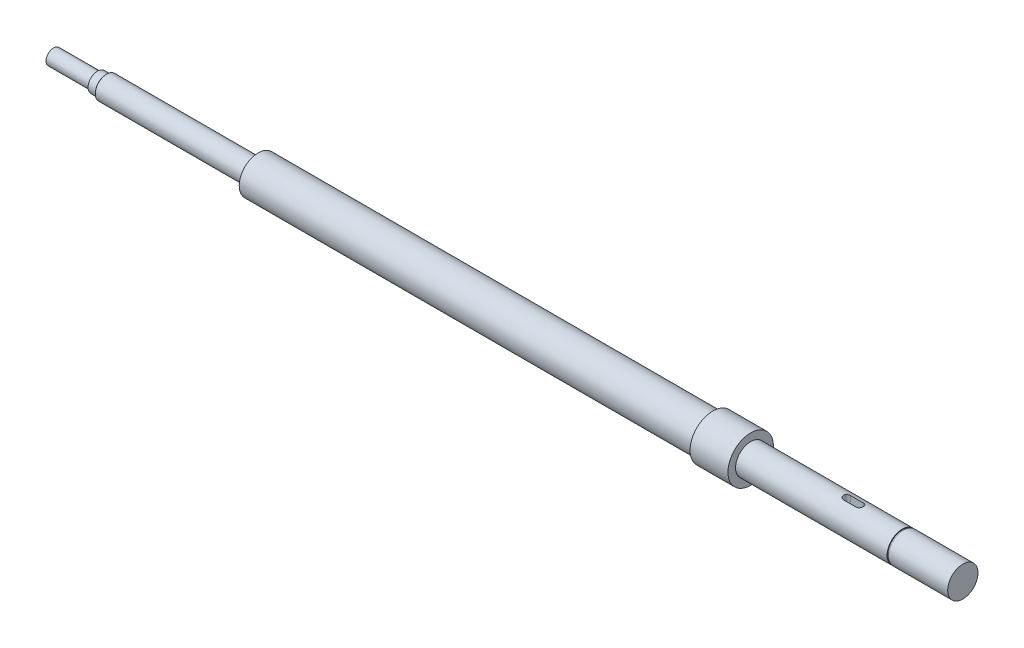
ISO-10303-21;
HEADER;
FILE_DESCRIPTION(('STEP AP214'),'2;1');
FILE_NAME('part.step','',(''),(''),'','','');
FILE_SCHEMA(('AUTOMOTIVE_DESIGN { 1 0 10303 214 1 1 1 1 }'));
ENDSEC;
DATA;
#1=APPLICATION_CONTEXT('core data for automotive mechanical design processes');
#2=APPLICATION_PROTOCOL_DEFINITION('international standard','automotive_design',2000,#1);
#3=PRODUCT_CONTEXT('',#1,'mechanical');
#4=PRODUCT('Part','Part','',(#3));
#5=PRODUCT_RELATED_PRODUCT_CATEGORY('part','',(#4));
#6=PRODUCT_DEFINITION_FORMATION('','',#4);
#7=PRODUCT_DEFINITION_CONTEXT('part definition',#1,'design');
#8=PRODUCT_DEFINITION('design','',#6,#7);
#9=PRODUCT_DEFINITION_SHAPE('','',#8);
#10=(LENGTH_UNIT() NAMED_UNIT(*) SI_UNIT(.MILLI.,.METRE.));
#11=(NAMED_UNIT(*) PLANE_ANGLE_UNIT() SI_UNIT($,.RADIAN.));
#12=(NAMED_UNIT(*) SI_UNIT($,.STERADIAN.) SOLID_ANGLE_UNIT());
#13=UNCERTAINTY_MEASURE_WITH_UNIT(LENGTH_MEASURE(1.E-05),#10,'distance_accuracy_value','');
#14=(GEOMETRIC_REPRESENTATION_CONTEXT(3) GLOBAL_UNCERTAINTY_ASSIGNED_CONTEXT((#13)) GLOBAL_UNIT_ASSIGNED_CONTEXT((#10,
#11,#12)) REPRESENTATION_CONTEXT('',''));
#15=CARTESIAN_POINT('',(0.,0.,0.));
#16=DIRECTION('',(0.,0.,1.));
#17=DIRECTION('',(1.,0.,0.));
#18=AXIS2_PLACEMENT_3D('',#15,#16,#17);
#19=CARTESIAN_POINT('',(560.,0.,0.));
#20=DIRECTION('',(-1.,0.,0.));
#21=DIRECTION('',(0.,0.,1.));
#22=AXIS2_PLACEMENT_3D('',#19,#20,#21);
#23=CYLINDRICAL_SURFACE('',#22,10.);
#24=CARTESIAN_POINT('',(560.,0.,0.));
#25=DIRECTION('',(-1.,0.,0.));
#26=DIRECTION('',(0.,0.,1.));
#27=AXIS2_PLACEMENT_3D('',#24,#25,#26);
#28=CIRCLE('',#27,10.);
#29=CARTESIAN_POINT('',(560.,0.,10.));
#30=VERTEX_POINT('',#29);
#31=EDGE_CURVE('E414',#30,#30,#28,.F.);
#32=ORIENTED_EDGE('',*,*,#31,.F.);
#33=EDGE_LOOP('',(#32));
#34=FACE_BOUND('',#33,.T.);
#35=CARTESIAN_POINT('',(460.,0.,0.));
#36=DIRECTION('',(-1.,0.,0.));
#37=DIRECTION('',(0.,0.,1.));
#38=AXIS2_PLACEMENT_3D('',#35,#36,#37);
#39=CIRCLE('',#38,10.);
#40=CARTESIAN_POINT('',(460.,0.,10.));
#41=VERTEX_POINT('',#40);
#42=EDGE_CURVE('E419',#41,#41,#39,.T.);
#43=ORIENTED_EDGE('',*,*,#42,.F.);
#44=EDGE_LOOP('',(#43));
#45=FACE_BOUND('',#44,.T.);
#46=DIRECTION('',(-1.,0.,0.));
#47=VECTOR('',#46,1.);
#48=CARTESIAN_POINT('',(560.,-9.716185001749,-2.36553355752731));
#49=LINE('',#48,#47);
#50=CARTESIAN_POINT('',(532.010381059042,-9.716185001749,-2.36553355752731));
#51=VERTEX_POINT('',#50);
#52=CARTESIAN_POINT('',(523.620270870022,-9.716185001749,-2.36553355752731));
#53=VERTEX_POINT('',#52);
#54=EDGE_CURVE('E456',#51,#53,#49,.T.);
#55=ORIENTED_EDGE('',*,*,#54,.T.);
#56=CARTESIAN_POINT('',(523.620270870022,-9.716185001749,-2.36553355752731));
#57=CARTESIAN_POINT('',(523.554734219503,-9.71617813615582,-2.36554101061923));
#58=CARTESIAN_POINT('',(523.489201902924,-9.71684792605506,-2.36281014204706));
#59=CARTESIAN_POINT('',(523.35862497444,-9.71948992140805,-2.35192962666516));
#60=CARTESIAN_POINT('',(523.293580288446,-9.72146192477843,-2.34378082063412));
#61=CARTESIAN_POINT('',(523.16455605733,-9.72665269246422,-2.32214222404428));
#62=CARTESIAN_POINT('',(523.100574769825,-9.72986915190057,-2.30866230631367));
#63=CARTESIAN_POINT('',(522.974025136161,-9.73744767182783,-2.27648498541819));
#64=CARTESIAN_POINT('',(522.911456805409,-9.74180974480331,-2.25778752539391));
#65=CARTESIAN_POINT('',(522.726529861349,-9.75643328055067,-2.19406830206997));
#66=CARTESIAN_POINT('',(522.60682772248,-9.76823730970764,-2.14139912730308));
#67=CARTESIAN_POINT('',(522.377991044977,-9.79461754473958,-2.01729176434513));
#68=CARTESIAN_POINT('',(522.268858845049,-9.80919436201676,-1.94584943532952));
#69=CARTESIAN_POINT('',(522.062063166862,-9.83979766287969,-1.78471538783754));
#70=CARTESIAN_POINT('',(521.964635549542,-9.85584515791481,-1.69472439774039));
#71=CARTESIAN_POINT('',(521.786104744101,-9.88739971424029,-1.49968977610094));
#72=CARTESIAN_POINT('',(521.70500413809,-9.90290668972761,-1.39464376810435));
#73=CARTESIAN_POINT('',(521.560473201778,-9.93186429008413,-1.17087013949126));
#74=CARTESIAN_POINT('',(521.49727436327,-9.94528704297193,-1.05198906921125));
#75=CARTESIAN_POINT('',(521.391847429846,-9.96832286380811,-0.80492786347149));
#76=CARTESIAN_POINT('',(521.349615508137,-9.97793662689216,-0.67674942982469));
#77=CARTESIAN_POINT('',(521.288071771701,-9.99212278814533,-0.417203439663509));
#78=CARTESIAN_POINT('',(521.268356614351,-9.996783795409,-0.285936451191038));
#79=CARTESIAN_POINT('',(521.251142201607,-10.0008473204292,-0.0218780336812813));
#80=CARTESIAN_POINT('',(521.253640491668,-10.0002504191748,0.110913225307553));
#81=CARTESIAN_POINT('',(521.280488178315,-9.99393192326267,0.371454673270837));
#82=CARTESIAN_POINT('',(521.304401979146,-9.98831249229277,0.499252595421149));
#83=CARTESIAN_POINT('',(521.372704167039,-9.9726982129403,0.748966787582892));
#84=CARTESIAN_POINT('',(521.417093401907,-9.96270318338231,0.870882813817257));
#85=CARTESIAN_POINT('',(521.525453939881,-9.93930073089943,1.10655021769589));
#86=CARTESIAN_POINT('',(521.589585001563,-9.92586562450444,1.22022527563861));
#87=CARTESIAN_POINT('',(521.735487132521,-9.89704804120039,1.43535259240749));
#88=CARTESIAN_POINT('',(521.817260522926,-9.88166530816026,1.53680324017866));
#89=CARTESIAN_POINT('',(521.99846615468,-9.85019619513032,1.72718935199965));
#90=CARTESIAN_POINT('',(522.098277501328,-9.83410179459663,1.81576297894188));
#91=CARTESIAN_POINT('',(522.311535414834,-9.8033631548963,1.97501139727239));
#92=CARTESIAN_POINT('',(522.424985692825,-9.78871931241045,2.04568130075511));
#93=CARTESIAN_POINT('',(522.662972769855,-9.76251130099033,2.16732020882583));
#94=CARTESIAN_POINT('',(522.787557058201,-9.75096125437306,2.2181993357095));
#95=CARTESIAN_POINT('',(523.043772276872,-9.7324389446703,2.2981173708448));
#96=CARTESIAN_POINT('',(523.175392382633,-9.72545985664113,2.3271888497891));
#97=CARTESIAN_POINT('',(523.360151755326,-9.7195271780491,2.35177034119793));
#98=CARTESIAN_POINT('',(523.412077472829,-9.7182756252396,2.35693272635749));
#99=CARTESIAN_POINT('',(523.516084310452,-9.71660500821227,2.3638103125256));
#100=CARTESIAN_POINT('',(523.568165034806,-9.71618457891591,2.36553116613077));
#101=CARTESIAN_POINT('',(523.620270870022,-9.716185001749,2.36553355752731));
#102=B_SPLINE_CURVE_WITH_KNOTS('',3,(#56,#57,#58,#59,#60,#61,#62,#63,#64,#65,#66,#67,#68,#69,
#70,#71,#72,#73,#74,#75,#76,#77,#78,#79,#80,#81,#82,#83,#84,#85,#86,#87,#88,#89,#90,#91,#92,#93,
#94,#95,#96,#97,#98,#99,#100,#101),.UNSPECIFIED.,.F.,.F.,(4,2,2,2,2,2,2,2,2,2,2,2,2,2,2,2,2,2,2,
2,2,2,4),(0.,0.1965421552874,0.393053817439709,0.589203245848046,0.785354811924298,
1.17729236123002,1.56931643349763,1.96824542021148,2.36723744788776,2.77117515918009,
3.17503911837194,3.57154924838462,3.96801556531298,4.35659636782447,4.74519326138159,
5.13702139411566,5.52890110953009,5.9302543298031,6.33171700594944,6.73498216967495,
7.13764383313922,7.29413852940338,7.45037597674334),.UNSPECIFIED.);
#103=CARTESIAN_POINT('',(523.620270870022,-9.716185001749,2.36553355752731));
#104=VERTEX_POINT('',#103);
#105=EDGE_CURVE('E345',#53,#104,#102,.T.);
#106=ORIENTED_EDGE('',*,*,#105,.T.);
#107=DIRECTION('',(-1.,0.,0.));
#108=VECTOR('',#107,1.);
#109=CARTESIAN_POINT('',(560.,-9.716185001749,2.36553355752731));
#110=LINE('',#109,#108);
#111=CARTESIAN_POINT('',(532.010381059042,-9.716185001749,2.36553355752731));
#112=VERTEX_POINT('',#111);
#113=EDGE_CURVE('E467',#104,#112,#110,.F.);
#114=ORIENTED_EDGE('',*,*,#113,.T.);
#115=CARTESIAN_POINT('',(532.010381059042,-9.716185001749,2.36553355752731));
#116=CARTESIAN_POINT('',(532.075917709561,-9.71617813615582,2.36554101061923));
#117=CARTESIAN_POINT('',(532.141450026139,-9.71684792605506,2.36281014204706));
#118=CARTESIAN_POINT('',(532.272026954624,-9.71948992140805,2.35192962666516));
#119=CARTESIAN_POINT('',(532.337071640618,-9.72146192477843,2.34378082063412));
#120=CARTESIAN_POINT('',(532.466095871734,-9.72665269246421,2.32214222404429));
#121=CARTESIAN_POINT('',(532.530077159239,-9.72986915190056,2.30866230631372));
#122=CARTESIAN_POINT('',(532.656626792903,-9.73744767182782,2.27648498541825));
#123=CARTESIAN_POINT('',(532.719195123655,-9.7418097448033,2.25778752539395));
#124=CARTESIAN_POINT('',(532.904122067715,-9.75643328055066,2.19406830206999));
#125=CARTESIAN_POINT('',(533.023824206584,-9.76823730970763,2.14139912730312));
#126=CARTESIAN_POINT('',(533.252660884087,-9.79461754473957,2.01729176434518));
#127=CARTESIAN_POINT('',(533.361793084015,-9.80919436201675,1.94584943532955));
#128=CARTESIAN_POINT('',(533.568588762202,-9.83979766287969,1.78471538783754));
#129=CARTESIAN_POINT('',(533.666016379522,-9.85584515791481,1.69472439774038));
#130=CARTESIAN_POINT('',(533.844547184962,-9.88739971424029,1.49968977610094));
#131=CARTESIAN_POINT('',(533.925647790973,-9.90290668972761,1.39464376810435));
#132=CARTESIAN_POINT('',(534.070178727286,-9.93186429008413,1.17087013949126));
#133=CARTESIAN_POINT('',(534.133377565794,-9.94528704297193,1.05198906921125));
#134=CARTESIAN_POINT('',(534.238804499218,-9.96832286380811,0.80492786347149));
#135=CARTESIAN_POINT('',(534.281036420927,-9.97793662689216,0.67674942982469));
#136=CARTESIAN_POINT('',(534.342580157363,-9.99212278814533,0.417203439663509));
#137=CARTESIAN_POINT('',(534.362295314713,-9.996783795409,0.285936451191038));
#138=CARTESIAN_POINT('',(534.379509727457,-10.0008473204292,0.0218780336812813));
#139=CARTESIAN_POINT('',(534.377011437396,-10.0002504191748,-0.110913225307553));
#140=CARTESIAN_POINT('',(534.350163750749,-9.99393192326267,-0.371454673270837));
#141=CARTESIAN_POINT('',(534.326249949918,-9.98831249229277,-0.499252595421149));
#142=CARTESIAN_POINT('',(534.257947762025,-9.9726982129403,-0.748966787582892));
#143=CARTESIAN_POINT('',(534.213558527157,-9.96270318338231,-0.870882813817257));
#144=CARTESIAN_POINT('',(534.105197989183,-9.93930073089943,-1.10655021769589));
#145=CARTESIAN_POINT('',(534.041066927501,-9.92586562450444,-1.22022527563861));
#146=CARTESIAN_POINT('',(533.895164796543,-9.89704804120039,-1.43535259240749));
#147=CARTESIAN_POINT('',(533.813391406138,-9.88166530816026,-1.53680324017866));
#148=CARTESIAN_POINT('',(533.632185774384,-9.85019619513032,-1.72718935199965));
#149=CARTESIAN_POINT('',(533.532374427736,-9.83410179459663,-1.81576297894188));
#150=CARTESIAN_POINT('',(533.31911651423,-9.8033631548963,-1.97501139727239));
#151=CARTESIAN_POINT('',(533.205666236239,-9.78871931241045,-2.04568130075511));
#152=CARTESIAN_POINT('',(532.967679159209,-9.76251130099033,-2.16732020882583));
#153=CARTESIAN_POINT('',(532.843094870863,-9.75096125437306,-2.2181993357095));
#154=CARTESIAN_POINT('',(532.586879652192,-9.7324389446703,-2.2981173708448));
#155=CARTESIAN_POINT('',(532.455259546431,-9.72545985664113,-2.3271888497891));
#156=CARTESIAN_POINT('',(532.270500173738,-9.7195271780491,-2.35177034119793));
#157=CARTESIAN_POINT('',(532.218574456235,-9.7182756252396,-2.35693272635749));
#158=CARTESIAN_POINT('',(532.114567618612,-9.71660500821227,-2.3638103125256));
#159=CARTESIAN_POINT('',(532.062486894258,-9.71618457891591,-2.36553116613077));
#160=CARTESIAN_POINT('',(532.010381059042,-9.716185001749,-2.36553355752731));
#161=B_SPLINE_CURVE_WITH_KNOTS('',3,(#115,#116,#117,#118,#119,#120,#121,#122,#123,#124,#125,
#126,#127,#128,#129,#130,#131,#132,#133,#134,#135,#136,#137,#138,#139,#140,#141,#142,#143,#144,
#145,#146,#147,#148,#149,#150,#151,#152,#153,#154,#155,#156,#157,#158,#159,#160),.UNSPECIFIED.,
.F.,.F.,(4,2,2,2,2,2,2,2,2,2,2,2,2,2,2,2,2,2,2,2,2,2,4),(0.,0.1965421552874,0.393053817439709,
0.589203245847703,0.785354811924297,1.17729236122989,1.56931643349764,1.96824542021149,
2.36723744788776,2.77117515918009,3.17503911837194,3.57154924838462,3.96801556531298,
4.35659636782447,4.74519326138159,5.13702139411566,5.52890110953009,5.9302543298031,
6.33171700594945,6.73498216967495,7.13764383313922,7.29413852940338,7.45037597674334),.UNSPECIFIED.);
#162=EDGE_CURVE('E461',#112,#51,#161,.T.);
#163=ORIENTED_EDGE('',*,*,#162,.T.);
#164=EDGE_LOOP('',(#55,#106,#114,#163));
#165=FACE_BOUND('',#164,.T.);
#166=DIRECTION('',(-1.,0.,0.));
#167=VECTOR('',#166,1.);
#168=CARTESIAN_POINT('',(560.,9.716185001749,2.36553355752731));
#169=LINE('',#168,#167);
#170=CARTESIAN_POINT('',(532.010381059042,9.716185001749,2.36553355752731));
#171=VERTEX_POINT('',#170);
#172=CARTESIAN_POINT('',(523.620270870022,9.716185001749,2.36553355752731));
#173=VERTEX_POINT('',#172);
#174=EDGE_CURVE('E330',#171,#173,#169,.T.);
#175=ORIENTED_EDGE('',*,*,#174,.T.);
#176=CARTESIAN_POINT('',(523.620270870022,9.716185001749,2.36553355752731));
#177=CARTESIAN_POINT('',(523.554734219503,9.71617813615582,2.36554101061923));
#178=CARTESIAN_POINT('',(523.489201902924,9.71684792605506,2.36281014204706));
#179=CARTESIAN_POINT('',(523.35862497444,9.71948992140805,2.35192962666516));
#180=CARTESIAN_POINT('',(523.293580288446,9.72146192477843,2.34378082063412));
#181=CARTESIAN_POINT('',(523.16455605733,9.72665269246422,2.32214222404428));
#182=CARTESIAN_POINT('',(523.100574769825,9.72986915190057,2.30866230631367));
#183=CARTESIAN_POINT('',(522.974025136161,9.73744767182783,2.27648498541819));
#184=CARTESIAN_POINT('',(522.911456805409,9.74180974480331,2.25778752539391));
#185=CARTESIAN_POINT('',(522.726529861349,9.75643328055067,2.19406830206997));
#186=CARTESIAN_POINT('',(522.60682772248,9.76823730970764,2.14139912730308));
#187=CARTESIAN_POINT('',(522.377991044977,9.79461754473958,2.01729176434513));
#188=CARTESIAN_POINT('',(522.268858845049,9.80919436201676,1.94584943532952));
#189=CARTESIAN_POINT('',(522.062063166862,9.83979766287969,1.78471538783754));
#190=CARTESIAN_POINT('',(521.964635549542,9.85584515791481,1.69472439774039));
#191=CARTESIAN_POINT('',(521.786104744101,9.88739971424029,1.49968977610094));
#192=CARTESIAN_POINT('',(521.70500413809,9.90290668972761,1.39464376810435));
#193=CARTESIAN_POINT('',(521.560473201778,9.93186429008413,1.17087013949126));
#194=CARTESIAN_POINT('',(521.49727436327,9.94528704297193,1.05198906921125));
#195=CARTESIAN_POINT('',(521.391847429846,9.96832286380811,0.80492786347149));
#196=CARTESIAN_POINT('',(521.349615508137,9.97793662689216,0.67674942982469));
#197=CARTESIAN_POINT('',(521.288071771701,9.99212278814533,0.417203439663509));
#198=CARTESIAN_POINT('',(521.268356614351,9.996783795409,0.285936451191038));
#199=CARTESIAN_POINT('',(521.251142201607,10.0008473204292,0.0218780336812813));
#200=CARTESIAN_POINT('',(521.253640491668,10.0002504191748,-0.110913225307553));
#201=CARTESIAN_POINT('',(521.280488178315,9.99393192326267,-0.371454673270837));
#202=CARTESIAN_POINT('',(521.304401979146,9.98831249229277,-0.499252595421149));
#203=CARTESIAN_POINT('',(521.372704167039,9.9726982129403,-0.748966787582892));
#204=CARTESIAN_POINT('',(521.417093401907,9.96270318338231,-0.870882813817257));
#205=CARTESIAN_POINT('',(521.525453939881,9.93930073089943,-1.10655021769589));
#206=CARTESIAN_POINT('',(521.589585001563,9.92586562450444,-1.22022527563861));
#207=CARTESIAN_POINT('',(521.735487132521,9.89704804120039,-1.43535259240749));
#208=CARTESIAN_POINT('',(521.817260522926,9.88166530816026,-1.53680324017866));
#209=CARTESIAN_POINT('',(521.99846615468,9.85019619513032,-1.72718935199965));
#210=CARTESIAN_POINT('',(522.098277501328,9.83410179459663,-1.81576297894188));
#211=CARTESIAN_POINT('',(522.311535414834,9.8033631548963,-1.97501139727239));
#212=CARTESIAN_POINT('',(522.424985692825,9.78871931241045,-2.04568130075511));
#213=CARTESIAN_POINT('',(522.662972769855,9.76251130099033,-2.16732020882583));
#214=CARTESIAN_POINT('',(522.787557058201,9.75096125437306,-2.2181993357095));
#215=CARTESIAN_POINT('',(523.043772276872,9.7324389446703,-2.2981173708448));
#216=CARTESIAN_POINT('',(523.175392382633,9.72545985664113,-2.3271888497891));
#217=CARTESIAN_POINT('',(523.360151755326,9.7195271780491,-2.35177034119793));
#218=CARTESIAN_POINT('',(523.412077472829,9.7182756252396,-2.35693272635749));
#219=CARTESIAN_POINT('',(523.516084310452,9.71660500821227,-2.3638103125256));
#220=CARTESIAN_POINT('',(523.568165034806,9.71618457891591,-2.36553116613077));
#221=CARTESIAN_POINT('',(523.620270870022,9.716185001749,-2.36553355752731));
#222=B_SPLINE_CURVE_WITH_KNOTS('',3,(#176,#177,#178,#179,#180,#181,#182,#183,#184,#185,#186,
#187,#188,#189,#190,#191,#192,#193,#194,#195,#196,#197,#198,#199,#200,#201,#202,#203,#204,#205,
#206,#207,#208,#209,#210,#211,#212,#213,#214,#215,#216,#217,#218,#219,#220,#221),.UNSPECIFIED.,
.F.,.F.,(4,2,2,2,2,2,2,2,2,2,2,2,2,2,2,2,2,2,2,2,2,2,4),(0.,0.1965421552874,0.393053817439709,
0.589203245848046,0.785354811924298,1.17729236123002,1.56931643349763,1.96824542021148,
2.36723744788776,2.77117515918009,3.17503911837194,3.57154924838462,3.96801556531298,
4.35659636782447,4.74519326138159,5.13702139411566,5.52890110953009,5.9302543298031,
6.33171700594944,6.73498216967495,7.13764383313922,7.29413852940338,7.45037597674334),.UNSPECIFIED.);
#223=CARTESIAN_POINT('',(523.620270870022,9.716185001749,-2.36553355752731));
#224=VERTEX_POINT('',#223);
#225=EDGE_CURVE('E15',#173,#224,#222,.T.);
#226=ORIENTED_EDGE('',*,*,#225,.T.);
#227=DIRECTION('',(-1.,0.,0.));
#228=VECTOR('',#227,1.);
#229=CARTESIAN_POINT('',(560.,9.716185001749,-2.36553355752731));
#230=LINE('',#229,#228);
#231=CARTESIAN_POINT('',(532.010381059042,9.716185001749,-2.36553355752731));
#232=VERTEX_POINT('',#231);
#233=EDGE_CURVE('E493',#224,#232,#230,.F.);
#234=ORIENTED_EDGE('',*,*,#233,.T.);
#235=CARTESIAN_POINT('',(532.010381059042,9.716185001749,-2.36553355752731));
#236=CARTESIAN_POINT('',(532.075917709561,9.71617813615582,-2.36554101061923));
#237=CARTESIAN_POINT('',(532.141450026139,9.71684792605506,-2.36281014204706));
#238=CARTESIAN_POINT('',(532.272026954624,9.71948992140805,-2.35192962666516));
#239=CARTESIAN_POINT('',(532.337071640618,9.72146192477843,-2.34378082063412));
#240=CARTESIAN_POINT('',(532.466095871734,9.72665269246421,-2.32214222404429));
#241=CARTESIAN_POINT('',(532.530077159239,9.72986915190056,-2.30866230631372));
#242=CARTESIAN_POINT('',(532.656626792903,9.73744767182782,-2.27648498541825));
#243=CARTESIAN_POINT('',(532.719195123655,9.7418097448033,-2.25778752539395));
#244=CARTESIAN_POINT('',(532.904122067715,9.75643328055066,-2.19406830206999));
#245=CARTESIAN_POINT('',(533.023824206584,9.76823730970763,-2.14139912730312));
#246=CARTESIAN_POINT('',(533.252660884087,9.79461754473957,-2.01729176434518));
#247=CARTESIAN_POINT('',(533.361793084015,9.80919436201675,-1.94584943532955));
#248=CARTESIAN_POINT('',(533.568588762202,9.83979766287969,-1.78471538783754));
#249=CARTESIAN_POINT('',(533.666016379522,9.85584515791481,-1.69472439774038));
#250=CARTESIAN_POINT('',(533.844547184962,9.88739971424029,-1.49968977610094));
#251=CARTESIAN_POINT('',(533.925647790973,9.90290668972761,-1.39464376810435));
#252=CARTESIAN_POINT('',(534.070178727286,9.93186429008413,-1.17087013949126));
#253=CARTESIAN_POINT('',(534.133377565794,9.94528704297193,-1.05198906921125));
#254=CARTESIAN_POINT('',(534.238804499218,9.96832286380811,-0.80492786347149));
#255=CARTESIAN_POINT('',(534.281036420927,9.97793662689216,-0.67674942982469));
#256=CARTESIAN_POINT('',(534.342580157363,9.99212278814533,-0.417203439663509));
#257=CARTESIAN_POINT('',(534.362295314713,9.996783795409,-0.285936451191038));
#258=CARTESIAN_POINT('',(534.379509727457,10.0008473204292,-0.0218780336812813));
#259=CARTESIAN_POINT('',(534.377011437396,10.0002504191748,0.110913225307553));
#260=CARTESIAN_POINT('',(534.350163750749,9.99393192326267,0.371454673270837));
#261=CARTESIAN_POINT('',(534.326249949918,9.98831249229277,0.499252595421149));
#262=CARTESIAN_POINT('',(534.257947762025,9.9726982129403,0.748966787582892));
#263=CARTESIAN_POINT('',(534.213558527157,9.96270318338231,0.870882813817257));
#264=CARTESIAN_POINT('',(534.105197989183,9.93930073089943,1.10655021769589));
#265=CARTESIAN_POINT('',(534.041066927501,9.92586562450444,1.22022527563861));
#266=CARTESIAN_POINT('',(533.895164796543,9.89704804120039,1.43535259240749));
#267=CARTESIAN_POINT('',(533.813391406138,9.88166530816026,1.53680324017866));
#268=CARTESIAN_POINT('',(533.632185774384,9.85019619513032,1.72718935199965));
#269=CARTESIAN_POINT('',(533.532374427736,9.83410179459663,1.81576297894188));
#270=CARTESIAN_POINT('',(533.31911651423,9.8033631548963,1.97501139727239));
#271=CARTESIAN_POINT('',(533.205666236239,9.78871931241045,2.04568130075511));
#272=CARTESIAN_POINT('',(532.967679159209,9.76251130099033,2.16732020882583));
#273=CARTESIAN_POINT('',(532.843094870863,9.75096125437306,2.2181993357095));
#274=CARTESIAN_POINT('',(532.586879652192,9.7324389446703,2.2981173708448));
#275=CARTESIAN_POINT('',(532.455259546431,9.72545985664113,2.3271888497891));
#276=CARTESIAN_POINT('',(532.270500173738,9.7195271780491,2.35177034119793));
#277=CARTESIAN_POINT('',(532.218574456235,9.7182756252396,2.35693272635749));
#278=CARTESIAN_POINT('',(532.114567618612,9.71660500821227,2.3638103125256));
#279=CARTESIAN_POINT('',(532.062486894258,9.71618457891591,2.36553116613077));
#280=CARTESIAN_POINT('',(532.010381059042,9.716185001749,2.36553355752731));
#281=B_SPLINE_CURVE_WITH_KNOTS('',3,(#235,#236,#237,#238,#239,#240,#241,#242,#243,#244,#245,
#246,#247,#248,#249,#250,#251,#252,#253,#254,#255,#256,#257,#258,#259,#260,#261,#262,#263,#264,
#265,#266,#267,#268,#269,#270,#271,#272,#273,#274,#275,#276,#277,#278,#279,#280),.UNSPECIFIED.,
.F.,.F.,(4,2,2,2,2,2,2,2,2,2,2,2,2,2,2,2,2,2,2,2,2,2,4),(0.,0.1965421552874,0.393053817439709,
0.589203245847703,0.785354811924297,1.17729236122989,1.56931643349764,1.96824542021149,
2.36723744788776,2.77117515918009,3.17503911837194,3.57154924838462,3.96801556531298,
4.35659636782447,4.74519326138159,5.13702139411566,5.52890110953009,5.9302543298031,
6.33171700594945,6.73498216967495,7.13764383313922,7.29413852940338,7.45037597674334),.UNSPECIFIED.);
#282=EDGE_CURVE('E487',#232,#171,#281,.T.);
#283=ORIENTED_EDGE('',*,*,#282,.T.);
#284=EDGE_LOOP('',(#175,#226,#234,#283));
#285=FACE_BOUND('',#284,.T.);
#286=ADVANCED_FACE('F317',(#34,#45,#165,#285),#23,.T.);
#287=CARTESIAN_POINT('',(561.,0.,0.));
#288=DIRECTION('',(-1.,0.,0.));
#289=DIRECTION('',(0.,0.,1.));
#290=AXIS2_PLACEMENT_3D('',#287,#288,#289);
#291=PLANE('',#290);
#292=CARTESIAN_POINT('',(561.,0.,0.));
#293=DIRECTION('',(-1.,0.,0.));
#294=DIRECTION('',(0.,0.,1.));
#295=AXIS2_PLACEMENT_3D('',#292,#293,#294);
#296=CIRCLE('',#295,9.5);
#297=CARTESIAN_POINT('',(561.,0.,9.5));
#298=VERTEX_POINT('',#297);
#299=EDGE_CURVE('E411',#298,#298,#296,.T.);
#300=ORIENTED_EDGE('',*,*,#299,.F.);
#301=EDGE_LOOP('',(#300));
#302=FACE_BOUND('',#301,.T.);
#303=CARTESIAN_POINT('',(561.,0.,0.));
#304=DIRECTION('',(-1.,0.,0.));
#305=DIRECTION('',(0.,0.,1.));
#306=AXIS2_PLACEMENT_3D('',#303,#304,#305);
#307=CIRCLE('',#306,10.);
#308=CARTESIAN_POINT('',(561.,0.,10.));
#309=VERTEX_POINT('',#308);
#310=EDGE_CURVE('E400',#309,#309,#307,.T.);
#311=ORIENTED_EDGE('',*,*,#310,.T.);
#312=EDGE_LOOP('',(#311));
#313=FACE_BOUND('',#312,.T.);
#314=ADVANCED_FACE('F515',(#302,#313),#291,.T.);
#315=CARTESIAN_POINT('',(435.,0.,0.));
#316=DIRECTION('',(-1.,0.,0.));
#317=DIRECTION('',(0.,0.,1.));
#318=AXIS2_PLACEMENT_3D('',#315,#316,#317);
#319=PLANE('',#318);
#320=CARTESIAN_POINT('',(435.,0.,0.));
#321=DIRECTION('',(-1.,0.,0.));
#322=DIRECTION('',(0.,0.,1.));
#323=AXIS2_PLACEMENT_3D('',#320,#321,#322);
#324=CIRCLE('',#323,12.5);
#325=CARTESIAN_POINT('',(435.,0.,12.5));
#326=VERTEX_POINT('',#325);
#327=EDGE_CURVE('E429',#326,#326,#324,.T.);
#328=ORIENTED_EDGE('',*,*,#327,.F.);
#329=EDGE_LOOP('',(#328));
#330=FACE_BOUND('',#329,.T.);
#331=CARTESIAN_POINT('',(435.,0.,0.));
#332=DIRECTION('',(-1.,0.,0.));
#333=DIRECTION('',(0.,0.,1.));
#334=AXIS2_PLACEMENT_3D('',#331,#332,#333);
#335=CIRCLE('',#334,15.);
#336=CARTESIAN_POINT('',(435.,0.,15.));
#337=VERTEX_POINT('',#336);
#338=EDGE_CURVE('E425',#337,#337,#335,.T.);
#339=ORIENTED_EDGE('',*,*,#338,.T.);
#340=EDGE_LOOP('',(#339));
#341=FACE_BOUND('',#340,.T.);
#342=ADVANCED_FACE('F520',(#330,#341),#319,.T.);
#343=CARTESIAN_POINT('',(135.,0.,0.));
#344=DIRECTION('',(-1.,0.,0.));
#345=DIRECTION('',(0.,0.,1.));
#346=AXIS2_PLACEMENT_3D('',#343,#344,#345);
#347=PLANE('',#346);
#348=CARTESIAN_POINT('',(135.,0.,0.));
#349=DIRECTION('',(-1.,0.,0.));
#350=DIRECTION('',(0.,0.,1.));
#351=AXIS2_PLACEMENT_3D('',#348,#349,#350);
#352=CIRCLE('',#351,7.5);
#353=CARTESIAN_POINT('',(135.,0.,7.5));
#354=VERTEX_POINT('',#353);
#355=EDGE_CURVE('E435',#354,#354,#352,.T.);
#356=ORIENTED_EDGE('',*,*,#355,.F.);
#357=EDGE_LOOP('',(#356));
#358=FACE_BOUND('',#357,.T.);
#359=CARTESIAN_POINT('',(135.,0.,0.));
#360=DIRECTION('',(-1.,0.,0.));
#361=DIRECTION('',(0.,0.,1.));
#362=AXIS2_PLACEMENT_3D('',#359,#360,#361);
#363=CIRCLE('',#362,12.5);
#364=CARTESIAN_POINT('',(135.,0.,12.5));
#365=VERTEX_POINT('',#364);
#366=EDGE_CURVE('E428',#365,#365,#363,.T.);
#367=ORIENTED_EDGE('',*,*,#366,.T.);
#368=EDGE_LOOP('',(#367));
#369=FACE_BOUND('',#368,.T.);
#370=ADVANCED_FACE('F539',(#358,#369),#347,.T.);
#371=CARTESIAN_POINT('',(35.,0.,0.));
#372=DIRECTION('',(-1.,0.,0.));
#373=DIRECTION('',(0.,0.,1.));
#374=AXIS2_PLACEMENT_3D('',#371,#372,#373);
#375=PLANE('',#374);
#376=CARTESIAN_POINT('',(35.,0.,0.));
#377=DIRECTION('',(-1.,0.,0.));
#378=DIRECTION('',(0.,0.,1.));
#379=AXIS2_PLACEMENT_3D('',#376,#377,#378);
#380=CIRCLE('',#379,5.75);
#381=CARTESIAN_POINT('',(35.,0.,5.75));
#382=VERTEX_POINT('',#381);
#383=EDGE_CURVE('E441',#382,#382,#380,.T.);
#384=ORIENTED_EDGE('',*,*,#383,.F.);
#385=EDGE_LOOP('',(#384));
#386=FACE_BOUND('',#385,.T.);
#387=CARTESIAN_POINT('',(35.,0.,0.));
#388=DIRECTION('',(-1.,0.,0.));
#389=DIRECTION('',(0.,0.,1.));
#390=AXIS2_PLACEMENT_3D('',#387,#388,#389);
#391=CIRCLE('',#390,7.5);
#392=CARTESIAN_POINT('',(35.,0.,7.5));
#393=VERTEX_POINT('',#392);
#394=EDGE_CURVE('E432',#393,#393,#391,.T.);
#395=ORIENTED_EDGE('',*,*,#394,.T.);
#396=EDGE_LOOP('',(#395));
#397=FACE_BOUND('',#396,.T.);
#398=ADVANCED_FACE('F545',(#386,#397),#375,.T.);
#399=CARTESIAN_POINT('',(29.,0.,0.));
#400=DIRECTION('',(-1.,0.,0.));
#401=DIRECTION('',(0.,0.,1.));
#402=AXIS2_PLACEMENT_3D('',#399,#400,#401);
#403=PLANE('',#402);
#404=CARTESIAN_POINT('',(29.,0.,0.));
#405=DIRECTION('',(-1.,0.,0.));
#406=DIRECTION('',(0.,0.,1.));
#407=AXIS2_PLACEMENT_3D('',#404,#405,#406);
#408=CIRCLE('',#407,5.);
#409=CARTESIAN_POINT('',(29.,0.,5.));
#410=VERTEX_POINT('',#409);
#411=EDGE_CURVE('E453',#410,#410,#408,.T.);
#412=ORIENTED_EDGE('',*,*,#411,.F.);
#413=EDGE_LOOP('',(#412));
#414=FACE_BOUND('',#413,.T.);
#415=CARTESIAN_POINT('',(29.,0.,0.));
#416=DIRECTION('',(-1.,0.,0.));
#417=DIRECTION('',(0.,0.,1.));
#418=AXIS2_PLACEMENT_3D('',#415,#416,#417);
#419=CIRCLE('',#418,6.25);
#420=CARTESIAN_POINT('',(29.,0.,6.25));
#421=VERTEX_POINT('',#420);
#422=EDGE_CURVE('E449',#421,#421,#419,.T.);
#423=ORIENTED_EDGE('',*,*,#422,.T.);
#424=EDGE_LOOP('',(#423));
#425=FACE_BOUND('',#424,.T.);
#426=ADVANCED_FACE('F562',(#414,#425),#403,.T.);
#427=CARTESIAN_POINT('',(29.,0.,0.));
#428=DIRECTION('',(-1.,0.,0.));
#429=DIRECTION('',(0.,0.,1.));
#430=AXIS2_PLACEMENT_3D('',#427,#428,#429);
#431=CYLINDRICAL_SURFACE('',#430,5.);
#432=CARTESIAN_POINT('',(0.,0.,0.));
#433=DIRECTION('',(-1.,0.,0.));
#434=DIRECTION('',(0.,0.,1.));
#435=AXIS2_PLACEMENT_3D('',#432,#433,#434);
#436=CIRCLE('',#435,5.);
#437=CARTESIAN_POINT('',(0.,0.,5.));
#438=VERTEX_POINT('',#437);
#439=EDGE_CURVE('E452',#438,#438,#436,.T.);
#440=CARTESIAN_POINT('',(29.,0.,5.));
#441=CARTESIAN_POINT('',(28.6979166666667,0.,5.));
#442=CARTESIAN_POINT('',(28.3958333333333,0.,5.));
#443=CARTESIAN_POINT('',(27.7916666666667,0.,5.));
#444=CARTESIAN_POINT('',(27.4895833333333,0.,5.));
#445=CARTESIAN_POINT('',(26.8854166666667,0.,5.));
#446=CARTESIAN_POINT('',(26.5833333333333,0.,5.));
#447=CARTESIAN_POINT('',(25.9791666666667,0.,5.));
#448=CARTESIAN_POINT('',(25.6770833333333,0.,5.));
#449=CARTESIAN_POINT('',(25.0729166666667,0.,5.));
#450=CARTESIAN_POINT('',(24.7708333333333,0.,5.));
#451=CARTESIAN_POINT('',(24.1666666666667,0.,5.));
#452=CARTESIAN_POINT('',(23.8645833333333,0.,5.));
#453=CARTESIAN_POINT('',(23.2604166666667,0.,5.));
#454=CARTESIAN_POINT('',(22.9583333333333,0.,5.));
#455=CARTESIAN_POINT('',(22.3541666666667,0.,5.));
#456=CARTESIAN_POINT('',(22.0520833333333,0.,5.));
#457=CARTESIAN_POINT('',(21.4479166666667,0.,5.));
#458=CARTESIAN_POINT('',(21.1458333333333,0.,5.));
#459=CARTESIAN_POINT('',(20.5416666666667,0.,5.));
#460=CARTESIAN_POINT('',(20.2395833333333,0.,5.));
#461=CARTESIAN_POINT('',(19.6354166666667,0.,5.));
#462=CARTESIAN_POINT('',(19.3333333333333,0.,5.));
#463=CARTESIAN_POINT('',(18.7291666666667,0.,5.));
#464=CARTESIAN_POINT('',(18.4270833333333,0.,5.));
#465=CARTESIAN_POINT('',(17.8229166666667,0.,5.));
#466=CARTESIAN_POINT('',(17.5208333333333,0.,5.));
#467=CARTESIAN_POINT('',(16.9166666666667,0.,5.));
#468=CARTESIAN_POINT('',(16.6145833333333,0.,5.));
#469=CARTESIAN_POINT('',(16.0104166666667,0.,5.));
#470=CARTESIAN_POINT('',(15.7083333333333,0.,5.));
#471=CARTESIAN_POINT('',(15.1041666666667,0.,5.));
#472=CARTESIAN_POINT('',(14.8020833333333,0.,5.));
#473=CARTESIAN_POINT('',(14.1979166666667,0.,5.));
#474=CARTESIAN_POINT('',(13.8958333333333,0.,5.));
#475=CARTESIAN_POINT('',(13.2916666666667,0.,5.));
#476=CARTESIAN_POINT('',(12.9895833333333,0.,5.));
#477=CARTESIAN_POINT('',(12.3854166666667,0.,5.));
#478=CARTESIAN_POINT('',(12.0833333333333,0.,5.));
#479=CARTESIAN_POINT('',(11.4791666666667,0.,5.));
#480=CARTESIAN_POINT('',(11.1770833333333,0.,5.));
#481=CARTESIAN_POINT('',(10.5729166666667,0.,5.));
#482=CARTESIAN_POINT('',(10.2708333333333,0.,5.));
#483=CARTESIAN_POINT('',(9.66666666666667,0.,5.));
#484=CARTESIAN_POINT('',(9.36458333333333,0.,5.));
#485=CARTESIAN_POINT('',(8.76041666666667,0.,5.));
#486=CARTESIAN_POINT('',(8.45833333333334,0.,5.));
#487=CARTESIAN_POINT('',(7.85416666666667,0.,5.));
#488=CARTESIAN_POINT('',(7.55208333333334,0.,5.));
#489=CARTESIAN_POINT('',(6.94791666666667,0.,5.));
#490=CARTESIAN_POINT('',(6.64583333333334,0.,5.));
#491=CARTESIAN_POINT('',(6.04166666666667,0.,5.));
#492=CARTESIAN_POINT('',(5.73958333333333,0.,5.));
#493=CARTESIAN_POINT('',(5.13541666666667,0.,5.));
#494=CARTESIAN_POINT('',(4.83333333333333,0.,5.));
#495=CARTESIAN_POINT('',(4.22916666666667,0.,5.));
#496=CARTESIAN_POINT('',(3.92708333333333,0.,5.));
#497=CARTESIAN_POINT('',(3.32291666666667,0.,5.));
#498=CARTESIAN_POINT('',(3.02083333333333,0.,5.));
#499=CARTESIAN_POINT('',(2.41666666666667,0.,5.));
#500=CARTESIAN_POINT('',(2.11458333333334,0.,5.));
#501=CARTESIAN_POINT('',(1.51041666666667,0.,5.));
#502=CARTESIAN_POINT('',(1.20833333333333,0.,5.));
#503=CARTESIAN_POINT('',(0.604166666666667,0.,5.));
#504=CARTESIAN_POINT('',(0.302083333333333,0.,5.));
#505=CARTESIAN_POINT('',(0.,0.,5.));
#506=B_SPLINE_CURVE_WITH_KNOTS('',3,(#440,#441,#442,#443,#444,#445,#446,#447,#448,#449,#450,
#451,#452,#453,#454,#455,#456,#457,#458,#459,#460,#461,#462,#463,#464,#465,#466,#467,#468,#469,
#470,#471,#472,#473,#474,#475,#476,#477,#478,#479,#480,#481,#482,#483,#484,#485,#486,#487,#488,
#489,#490,#491,#492,#493,#494,#495,#496,#497,#498,#499,#500,#501,#502,#503,#504,#505),
.UNSPECIFIED.,.F.,.F.,(4,2,2,2,2,2,2,2,2,2,2,2,2,2,2,2,2,2,2,2,2,2,2,2,2,2,2,2,2,2,2,2,4),(0.,
0.906250000000001,1.8125,2.71875,3.625,4.53125,5.4375,6.34375,7.25,8.15625,9.0625,
9.96875000000001,10.875,11.78125,12.6875,13.59375,14.5,15.40625,16.3125,17.21875,18.125,
19.03125,19.9375,20.84375,21.75,22.65625,23.5625,24.46875,25.375,26.28125,27.1875,28.09375,29.),.UNSPECIFIED.);
#507=EDGE_CURVE('BSEAM572',#410,#438,#506,.T.);
#508=ORIENTED_EDGE('',*,*,#411,.T.);
#509=ORIENTED_EDGE('',*,*,#439,.F.);
#510=ORIENTED_EDGE('',*,*,#507,.T.);
#511=ORIENTED_EDGE('',*,*,#507,.F.);
#512=EDGE_LOOP('',(#508,#510,#509,#511));
#513=FACE_BOUND('',#512,.T.);
#514=ADVANCED_FACE('F572',(#513),#431,.T.);
#515=CARTESIAN_POINT('',(0.,0.,0.));
#516=DIRECTION('',(1.,0.,0.));
#517=DIRECTION('',(0.,0.,-1.));
#518=AXIS2_PLACEMENT_3D('',#515,#516,#517);
#519=PLANE('',#518);
#520=ORIENTED_EDGE('',*,*,#439,.T.);
#521=EDGE_LOOP('',(#520));
#522=FACE_BOUND('',#521,.T.);
#523=ADVANCED_FACE('F570',(#522),#519,.F.);
#524=CARTESIAN_POINT('',(34.,0.,0.));
#525=DIRECTION('',(-1.,0.,0.));
#526=DIRECTION('',(0.,0.,1.));
#527=AXIS2_PLACEMENT_3D('',#524,#525,#526);
#528=CYLINDRICAL_SURFACE('',#527,6.25);
#529=CARTESIAN_POINT('',(34.,0.,0.));
#530=DIRECTION('',(-1.,0.,0.));
#531=DIRECTION('',(0.,0.,1.));
#532=AXIS2_PLACEMENT_3D('',#529,#530,#531);
#533=CIRCLE('',#532,6.25);
#534=CARTESIAN_POINT('',(34.,0.,6.25));
#535=VERTEX_POINT('',#534);
#536=EDGE_CURVE('E444',#535,#535,#533,.F.);
#537=ORIENTED_EDGE('',*,*,#536,.F.);
#538=EDGE_LOOP('',(#537));
#539=FACE_BOUND('',#538,.T.);
#540=ORIENTED_EDGE('',*,*,#422,.F.);
#541=EDGE_LOOP('',(#540));
#542=FACE_BOUND('',#541,.T.);
#543=ADVANCED_FACE('F566',(#539,#542),#528,.T.);
#544=CARTESIAN_POINT('',(34.,0.,0.));
#545=DIRECTION('',(-1.,0.,0.));
#546=DIRECTION('',(0.,0.,1.));
#547=AXIS2_PLACEMENT_3D('',#544,#545,#546);
#548=PLANE('',#547);
#549=ORIENTED_EDGE('',*,*,#536,.T.);
#550=EDGE_LOOP('',(#549));
#551=FACE_BOUND('',#550,.T.);
#552=CARTESIAN_POINT('',(34.,0.,0.));
#553=DIRECTION('',(-1.,0.,0.));
#554=DIRECTION('',(0.,0.,1.));
#555=AXIS2_PLACEMENT_3D('',#552,#553,#554);
#556=CIRCLE('',#555,5.75);
#557=CARTESIAN_POINT('',(34.,0.,5.75));
#558=VERTEX_POINT('',#557);
#559=EDGE_CURVE('E438',#558,#558,#556,.T.);
#560=ORIENTED_EDGE('',*,*,#559,.T.);
#561=EDGE_LOOP('',(#560));
#562=FACE_BOUND('',#561,.T.);
#563=ADVANCED_FACE('F558',(#551,#562),#548,.F.);
#564=CARTESIAN_POINT('',(35.,0.,0.));
#565=DIRECTION('',(-1.,0.,0.));
#566=DIRECTION('',(0.,0.,1.));
#567=AXIS2_PLACEMENT_3D('',#564,#565,#566);
#568=CYLINDRICAL_SURFACE('',#567,5.75);
#569=ORIENTED_EDGE('',*,*,#383,.T.);
#570=EDGE_LOOP('',(#569));
#571=FACE_BOUND('',#570,.T.);
#572=ORIENTED_EDGE('',*,*,#559,.F.);
#573=EDGE_LOOP('',(#572));
#574=FACE_BOUND('',#573,.T.);
#575=ADVANCED_FACE('F553',(#571,#574),#568,.T.);
#576=CARTESIAN_POINT('',(135.,0.,0.));
#577=DIRECTION('',(-1.,0.,0.));
#578=DIRECTION('',(0.,0.,1.));
#579=AXIS2_PLACEMENT_3D('',#576,#577,#578);
#580=CYLINDRICAL_SURFACE('',#579,7.5);
#581=ORIENTED_EDGE('',*,*,#355,.T.);
#582=EDGE_LOOP('',(#581));
#583=FACE_BOUND('',#582,.T.);
#584=ORIENTED_EDGE('',*,*,#394,.F.);
#585=EDGE_LOOP('',(#584));
#586=FACE_BOUND('',#585,.T.);
#587=ADVANCED_FACE('F551',(#583,#586),#580,.T.);
#588=CARTESIAN_POINT('',(435.,0.,0.));
#589=DIRECTION('',(-1.,0.,0.));
#590=DIRECTION('',(0.,0.,1.));
#591=AXIS2_PLACEMENT_3D('',#588,#589,#590);
#592=CYLINDRICAL_SURFACE('',#591,12.5);
#593=ORIENTED_EDGE('',*,*,#327,.T.);
#594=EDGE_LOOP('',(#593));
#595=FACE_BOUND('',#594,.T.);
#596=ORIENTED_EDGE('',*,*,#366,.F.);
#597=EDGE_LOOP('',(#596));
#598=FACE_BOUND('',#597,.T.);
#599=ADVANCED_FACE('F532',(#595,#598),#592,.T.);
#600=CARTESIAN_POINT('',(460.,0.,0.));
#601=DIRECTION('',(-1.,0.,0.));
#602=DIRECTION('',(0.,0.,1.));
#603=AXIS2_PLACEMENT_3D('',#600,#601,#602);
#604=CYLINDRICAL_SURFACE('',#603,15.);
#605=CARTESIAN_POINT('',(460.,0.,0.));
#606=DIRECTION('',(-1.,0.,0.));
#607=DIRECTION('',(0.,0.,1.));
#608=AXIS2_PLACEMENT_3D('',#605,#606,#607);
#609=CIRCLE('',#608,15.);
#610=CARTESIAN_POINT('',(460.,0.,15.));
#611=VERTEX_POINT('',#610);
#612=EDGE_CURVE('E422',#611,#611,#609,.F.);
#613=ORIENTED_EDGE('',*,*,#612,.F.);
#614=EDGE_LOOP('',(#613));
#615=FACE_BOUND('',#614,.T.);
#616=ORIENTED_EDGE('',*,*,#338,.F.);
#617=EDGE_LOOP('',(#616));
#618=FACE_BOUND('',#617,.T.);
#619=ADVANCED_FACE('F527',(#615,#618),#604,.T.);
#620=CARTESIAN_POINT('',(460.,0.,0.));
#621=DIRECTION('',(-1.,0.,0.));
#622=DIRECTION('',(0.,0.,1.));
#623=AXIS2_PLACEMENT_3D('',#620,#621,#622);
#624=PLANE('',#623);
#625=ORIENTED_EDGE('',*,*,#612,.T.);
#626=EDGE_LOOP('',(#625));
#627=FACE_BOUND('',#626,.T.);
#628=ORIENTED_EDGE('',*,*,#42,.T.);
#629=EDGE_LOOP('',(#628));
#630=FACE_BOUND('',#629,.T.);
#631=ADVANCED_FACE('F475',(#627,#630),#624,.F.);
#632=ORIENTED_EDGE('',*,*,#105,.F.);
#633=ORIENTED_EDGE('',*,*,#54,.F.);
#634=ORIENTED_EDGE('',*,*,#162,.F.);
#635=ORIENTED_EDGE('',*,*,#113,.F.);
#636=EDGE_LOOP('',(#632,#633,#634,#635));
#637=FACE_BOUND('',#636,.T.);
#638=ADVANCED_FACE('F469',(#637),#23,.T.);
#639=CARTESIAN_POINT('',(560.,0.,0.));
#640=DIRECTION('',(-1.,0.,0.));
#641=DIRECTION('',(0.,0.,1.));
#642=AXIS2_PLACEMENT_3D('',#639,#640,#641);
#643=PLANE('',#642);
#644=ORIENTED_EDGE('',*,*,#31,.T.);
#645=EDGE_LOOP('',(#644));
#646=FACE_BOUND('',#645,.T.);
#647=CARTESIAN_POINT('',(560.,0.,0.));
#648=DIRECTION('',(-1.,0.,0.));
#649=DIRECTION('',(0.,0.,1.));
#650=AXIS2_PLACEMENT_3D('',#647,#648,#649);
#651=CIRCLE('',#650,9.5);
#652=CARTESIAN_POINT('',(560.,0.,9.5));
#653=VERTEX_POINT('',#652);
#654=EDGE_CURVE('E410',#653,#653,#651,.T.);
#655=ORIENTED_EDGE('',*,*,#654,.T.);
#656=EDGE_LOOP('',(#655));
#657=FACE_BOUND('',#656,.T.);
#658=ADVANCED_FACE('F474',(#646,#657),#643,.F.);
#659=CARTESIAN_POINT('',(561.,0.,0.));
#660=DIRECTION('',(-1.,0.,0.));
#661=DIRECTION('',(0.,0.,1.));
#662=AXIS2_PLACEMENT_3D('',#659,#660,#661);
#663=CYLINDRICAL_SURFACE('',#662,9.5);
#664=ORIENTED_EDGE('',*,*,#299,.T.);
#665=EDGE_LOOP('',(#664));
#666=FACE_BOUND('',#665,.T.);
#667=ORIENTED_EDGE('',*,*,#654,.F.);
#668=EDGE_LOOP('',(#667));
#669=FACE_BOUND('',#668,.T.);
#670=ADVANCED_FACE('F638',(#666,#669),#663,.T.);
#671=CARTESIAN_POINT('',(2028.35569799683,0.,0.));
#672=DIRECTION('',(-1.,0.,0.));
#673=DIRECTION('',(0.,0.,1.));
#674=AXIS2_PLACEMENT_3D('',#671,#672,#673);
#675=CYLINDRICAL_SURFACE('',#674,10.);
#676=ORIENTED_EDGE('',*,*,#310,.F.);
#677=EDGE_LOOP('',(#676));
#678=FACE_BOUND('',#677,.T.);
#679=CARTESIAN_POINT('',(600.,0.,0.));
#680=DIRECTION('',(1.,0.,0.));
#681=DIRECTION('',(0.,0.,-1.));
#682=AXIS2_PLACEMENT_3D('',#679,#680,#681);
#683=CIRCLE('',#682,10.);
#684=CARTESIAN_POINT('',(600.,0.,-10.));
#685=VERTEX_POINT('',#684);
#686=EDGE_CURVE('E407',#685,#685,#683,.F.);
#687=ORIENTED_EDGE('',*,*,#686,.T.);
#688=EDGE_LOOP('',(#687));
#689=FACE_BOUND('',#688,.T.);
#690=ADVANCED_FACE('F582',(#678,#689),#675,.T.);
#691=CARTESIAN_POINT('',(600.,0.,0.));
#692=DIRECTION('',(1.,0.,0.));
#693=DIRECTION('',(0.,0.,-1.));
#694=AXIS2_PLACEMENT_3D('',#691,#692,#693);
#695=PLANE('',#694);
#696=ORIENTED_EDGE('',*,*,#686,.F.);
#697=EDGE_LOOP('',(#696));
#698=FACE_BOUND('',#697,.T.);
#699=ADVANCED_FACE('F579',(#698),#695,.T.);
#700=CARTESIAN_POINT('',(523.620270870022,5.,0.));
#701=DIRECTION('',(0.,1.,0.));
#702=DIRECTION('',(0.,0.,1.));
#703=AXIS2_PLACEMENT_3D('',#700,#701,#702);
#704=CYLINDRICAL_SURFACE('',#703,2.36553355752731);
#705=ORIENTED_EDGE('',*,*,#225,.F.);
#706=DIRECTION('',(0.,1.,0.));
#707=VECTOR('',#706,1.);
#708=CARTESIAN_POINT('',(523.620270870022,5.,2.36553355752731));
#709=LINE('',#708,#707);
#710=CARTESIAN_POINT('',(523.620270870022,5.,2.36553355752731));
#711=VERTEX_POINT('',#710);
#712=EDGE_CURVE('E337',#711,#173,#709,.T.);
#713=ORIENTED_EDGE('',*,*,#712,.F.);
#714=CARTESIAN_POINT('',(523.620270870022,5.,0.));
#715=DIRECTION('',(0.,1.,0.));
#716=DIRECTION('',(0.,0.,1.));
#717=AXIS2_PLACEMENT_3D('',#714,#715,#716);
#718=CIRCLE('',#717,2.36553355752731);
#719=CARTESIAN_POINT('',(523.620270870022,5.,-2.36553355752731));
#720=VERTEX_POINT('',#719);
#721=EDGE_CURVE('E377',#720,#711,#718,.T.);
#722=ORIENTED_EDGE('',*,*,#721,.F.);
#723=DIRECTION('',(0.,1.,0.));
#724=VECTOR('',#723,1.);
#725=CARTESIAN_POINT('',(523.620270870022,5.,-2.36553355752731));
#726=LINE('',#725,#724);
#727=EDGE_CURVE('E398',#720,#224,#726,.T.);
#728=ORIENTED_EDGE('',*,*,#727,.T.);
#729=EDGE_LOOP('',(#705,#713,#722,#728));
#730=FACE_BOUND('',#729,.T.);
#731=ADVANCED_FACE('F374',(#730),#704,.F.);
#732=CARTESIAN_POINT('',(523.620270870022,5.,-2.36553355752731));
#733=DIRECTION('',(0.,0.,-1.));
#734=DIRECTION('',(-1.,0.,0.));
#735=AXIS2_PLACEMENT_3D('',#732,#733,#734);
#736=PLANE('',#735);
#737=ORIENTED_EDGE('',*,*,#233,.F.);
#738=ORIENTED_EDGE('',*,*,#727,.F.);
#739=DIRECTION('',(-1.,0.,0.));
#740=VECTOR('',#739,1.);
#741=CARTESIAN_POINT('',(523.620270870022,5.,-2.36553355752731));
#742=LINE('',#741,#740);
#743=CARTESIAN_POINT('',(532.010381059042,5.,-2.36553355752731));
#744=VERTEX_POINT('',#743);
#745=EDGE_CURVE('E381',#744,#720,#742,.T.);
#746=ORIENTED_EDGE('',*,*,#745,.F.);
#747=DIRECTION('',(0.,1.,0.));
#748=VECTOR('',#747,1.);
#749=CARTESIAN_POINT('',(532.010381059042,5.,-2.36553355752731));
#750=LINE('',#749,#748);
#751=EDGE_CURVE('E401',#744,#232,#750,.T.);
#752=ORIENTED_EDGE('',*,*,#751,.T.);
#753=EDGE_LOOP('',(#737,#738,#746,#752));
#754=FACE_BOUND('',#753,.T.);
#755=ADVANCED_FACE('F502',(#754),#736,.F.);
#756=CARTESIAN_POINT('',(532.010381059042,5.,0.));
#757=DIRECTION('',(0.,1.,0.));
#758=DIRECTION('',(0.,0.,1.));
#759=AXIS2_PLACEMENT_3D('',#756,#757,#758);
#760=CYLINDRICAL_SURFACE('',#759,2.36553355752731);
#761=ORIENTED_EDGE('',*,*,#282,.F.);
#762=ORIENTED_EDGE('',*,*,#751,.F.);
#763=CARTESIAN_POINT('',(532.010381059042,5.,0.));
#764=DIRECTION('',(0.,1.,0.));
#765=DIRECTION('',(0.,0.,1.));
#766=AXIS2_PLACEMENT_3D('',#763,#764,#765);
#767=CIRCLE('',#766,2.36553355752731);
#768=CARTESIAN_POINT('',(532.010381059042,5.,2.36553355752731));
#769=VERTEX_POINT('',#768);
#770=EDGE_CURVE('E390',#769,#744,#767,.T.);
#771=ORIENTED_EDGE('',*,*,#770,.F.);
#772=DIRECTION('',(0.,1.,0.));
#773=VECTOR('',#772,1.);
#774=CARTESIAN_POINT('',(532.010381059042,5.,2.36553355752731));
#775=LINE('',#774,#773);
#776=EDGE_CURVE('E380',#769,#171,#775,.T.);
#777=ORIENTED_EDGE('',*,*,#776,.T.);
#778=EDGE_LOOP('',(#761,#762,#771,#777));
#779=FACE_BOUND('',#778,.T.);
#780=ADVANCED_FACE('F500',(#779),#760,.F.);
#781=CARTESIAN_POINT('',(523.620270870022,5.,2.36553355752731));
#782=DIRECTION('',(0.,0.,1.));
#783=DIRECTION('',(1.,0.,0.));
#784=AXIS2_PLACEMENT_3D('',#781,#782,#783);
#785=PLANE('',#784);
#786=ORIENTED_EDGE('',*,*,#174,.F.);
#787=ORIENTED_EDGE('',*,*,#776,.F.);
#788=DIRECTION('',(1.,0.,0.));
#789=VECTOR('',#788,1.);
#790=CARTESIAN_POINT('',(523.620270870022,5.,2.36553355752731));
#791=LINE('',#790,#789);
#792=EDGE_CURVE('E384',#711,#769,#791,.T.);
#793=ORIENTED_EDGE('',*,*,#792,.F.);
#794=ORIENTED_EDGE('',*,*,#712,.T.);
#795=EDGE_LOOP('',(#786,#787,#793,#794));
#796=FACE_BOUND('',#795,.T.);
#797=ADVANCED_FACE('F385',(#796),#785,.F.);
#798=CARTESIAN_POINT('',(523.620270870022,5.,0.));
#799=DIRECTION('',(0.,1.,0.));
#800=DIRECTION('',(0.,0.,1.));
#801=AXIS2_PLACEMENT_3D('',#798,#799,#800);
#802=PLANE('',#801);
#803=ORIENTED_EDGE('',*,*,#721,.T.);
#804=ORIENTED_EDGE('',*,*,#792,.T.);
#805=ORIENTED_EDGE('',*,*,#770,.T.);
#806=ORIENTED_EDGE('',*,*,#745,.T.);
#807=EDGE_LOOP('',(#803,#804,#805,#806));
#808=FACE_BOUND('',#807,.T.);
#809=ADVANCED_FACE('F392',(#808),#802,.T.);
#810=CLOSED_SHELL('',(#286,#314,#342,#370,#398,#426,#514,#523,#543,#563,#575,#587,#599,#619,
#631,#638,#658,#670,#690,#699,#731,#755,#780,#797,#809));
#811=MANIFOLD_SOLID_BREP('B2',#810);
#812=ADVANCED_BREP_SHAPE_REPRESENTATION('',(#18,#811),#14);
#813=SHAPE_DEFINITION_REPRESENTATION(#9,#812);
ENDSEC;
END-ISO-10303-21;
